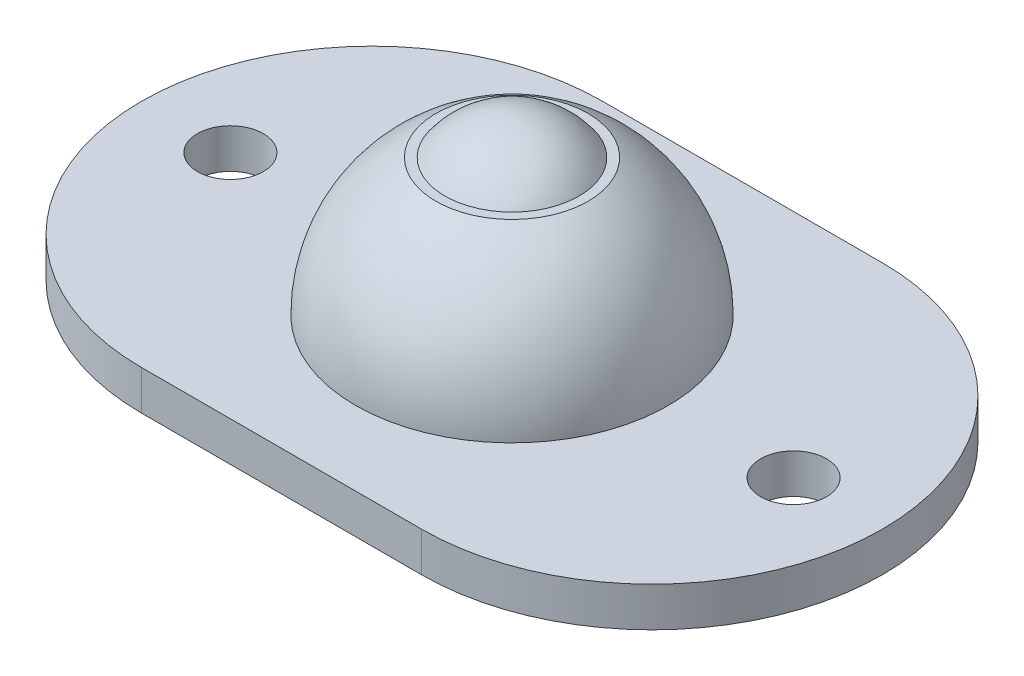
ISO-10303-21;
HEADER;
FILE_DESCRIPTION(('STEP AP214'),'2;1');
FILE_NAME('part.step','',(''),(''),'','','');
FILE_SCHEMA(('AUTOMOTIVE_DESIGN { 1 0 10303 214 1 1 1 1 }'));
ENDSEC;
DATA;
#1=APPLICATION_CONTEXT('core data for automotive mechanical design processes');
#2=APPLICATION_PROTOCOL_DEFINITION('international standard','automotive_design',2000,#1);
#3=PRODUCT_CONTEXT('',#1,'mechanical');
#4=PRODUCT('Part','Part','',(#3));
#5=PRODUCT_RELATED_PRODUCT_CATEGORY('part','',(#4));
#6=PRODUCT_DEFINITION_FORMATION('','',#4);
#7=PRODUCT_DEFINITION_CONTEXT('part definition',#1,'design');
#8=PRODUCT_DEFINITION('design','',#6,#7);
#9=PRODUCT_DEFINITION_SHAPE('','',#8);
#10=(LENGTH_UNIT() NAMED_UNIT(*) SI_UNIT(.MILLI.,.METRE.));
#11=(NAMED_UNIT(*) PLANE_ANGLE_UNIT() SI_UNIT($,.RADIAN.));
#12=(NAMED_UNIT(*) SI_UNIT($,.STERADIAN.) SOLID_ANGLE_UNIT());
#13=UNCERTAINTY_MEASURE_WITH_UNIT(LENGTH_MEASURE(1.E-05),#10,'distance_accuracy_value','');
#14=(GEOMETRIC_REPRESENTATION_CONTEXT(3) GLOBAL_UNCERTAINTY_ASSIGNED_CONTEXT((#13)) GLOBAL_UNIT_ASSIGNED_CONTEXT((#10,
#11,#12)) REPRESENTATION_CONTEXT('',''));
#15=CARTESIAN_POINT('',(0.,0.,0.));
#16=DIRECTION('',(0.,0.,1.));
#17=DIRECTION('',(1.,0.,0.));
#18=AXIS2_PLACEMENT_3D('',#15,#16,#17);
#19=CARTESIAN_POINT('',(-8.5,2.4,0.));
#20=DIRECTION('',(0.,1.,0.));
#21=DIRECTION('',(0.,0.,1.));
#22=AXIS2_PLACEMENT_3D('',#19,#20,#21);
#23=PLANE('',#22);
#24=CARTESIAN_POINT('',(0.,2.4,0.));
#25=DIRECTION('',(0.,-1.,0.));
#26=DIRECTION('',(0.,0.,-1.));
#27=AXIS2_PLACEMENT_3D('',#24,#25,#26);
#28=CIRCLE('',#27,9.5);
#29=CARTESIAN_POINT('',(0.,2.4,-9.5));
#30=VERTEX_POINT('',#29);
#31=EDGE_CURVE('E132',#30,#30,#28,.T.);
#32=ORIENTED_EDGE('',*,*,#31,.T.);
#33=EDGE_LOOP('',(#32));
#34=FACE_BOUND('',#33,.T.);
#35=CARTESIAN_POINT('',(17.1,2.4,0.));
#36=DIRECTION('',(0.,1.,0.));
#37=DIRECTION('',(0.,0.,1.));
#38=AXIS2_PLACEMENT_3D('',#35,#36,#37);
#39=CIRCLE('',#38,2.);
#40=CARTESIAN_POINT('',(17.1,2.4,2.));
#41=VERTEX_POINT('',#40);
#42=EDGE_CURVE('E106',#41,#41,#39,.T.);
#43=ORIENTED_EDGE('',*,*,#42,.F.);
#44=EDGE_LOOP('',(#43));
#45=FACE_BOUND('',#44,.T.);
#46=CARTESIAN_POINT('',(-8.5,2.4,0.));
#47=DIRECTION('',(0.,1.,0.));
#48=DIRECTION('',(0.,0.,1.));
#49=AXIS2_PLACEMENT_3D('',#46,#47,#48);
#50=CIRCLE('',#49,14.);
#51=CARTESIAN_POINT('',(-8.5,2.4,-14.));
#52=VERTEX_POINT('',#51);
#53=CARTESIAN_POINT('',(-8.5,2.4,14.));
#54=VERTEX_POINT('',#53);
#55=EDGE_CURVE('E90',#52,#54,#50,.T.);
#56=ORIENTED_EDGE('',*,*,#55,.T.);
#57=DIRECTION('',(1.,0.,0.));
#58=VECTOR('',#57,1.);
#59=CARTESIAN_POINT('',(-8.5,2.4,14.));
#60=LINE('',#59,#58);
#61=CARTESIAN_POINT('',(8.5,2.4,14.));
#62=VERTEX_POINT('',#61);
#63=EDGE_CURVE('E85',#54,#62,#60,.T.);
#64=ORIENTED_EDGE('',*,*,#63,.T.);
#65=CARTESIAN_POINT('',(8.5,2.4,0.));
#66=DIRECTION('',(0.,1.,0.));
#67=DIRECTION('',(0.,0.,1.));
#68=AXIS2_PLACEMENT_3D('',#65,#66,#67);
#69=CIRCLE('',#68,14.);
#70=CARTESIAN_POINT('',(8.5,2.4,-14.));
#71=VERTEX_POINT('',#70);
#72=EDGE_CURVE('E88',#62,#71,#69,.T.);
#73=ORIENTED_EDGE('',*,*,#72,.T.);
#74=DIRECTION('',(-1.,0.,0.));
#75=VECTOR('',#74,1.);
#76=CARTESIAN_POINT('',(-8.5,2.4,-14.));
#77=LINE('',#76,#75);
#78=EDGE_CURVE('E55',#71,#52,#77,.T.);
#79=ORIENTED_EDGE('',*,*,#78,.T.);
#80=EDGE_LOOP('',(#56,#64,#73,#79));
#81=FACE_BOUND('',#80,.T.);
#82=CARTESIAN_POINT('',(-17.1,2.4,0.));
#83=DIRECTION('',(0.,1.,0.));
#84=DIRECTION('',(0.,0.,1.));
#85=AXIS2_PLACEMENT_3D('',#82,#83,#84);
#86=CIRCLE('',#85,2.);
#87=CARTESIAN_POINT('',(-17.1,2.4,2.));
#88=VERTEX_POINT('',#87);
#89=EDGE_CURVE('E121',#88,#88,#86,.T.);
#90=ORIENTED_EDGE('',*,*,#89,.F.);
#91=EDGE_LOOP('',(#90));
#92=FACE_BOUND('',#91,.T.);
#93=ADVANCED_FACE('F37',(#34,#45,#81,#92),#23,.T.);
#94=CARTESIAN_POINT('',(-8.5,0.,0.));
#95=DIRECTION('',(0.,1.,0.));
#96=DIRECTION('',(0.,0.,1.));
#97=AXIS2_PLACEMENT_3D('',#94,#95,#96);
#98=PLANE('',#97);
#99=CARTESIAN_POINT('',(-8.5,0.,0.));
#100=DIRECTION('',(0.,1.,0.));
#101=DIRECTION('',(0.,0.,1.));
#102=AXIS2_PLACEMENT_3D('',#99,#100,#101);
#103=CIRCLE('',#102,14.);
#104=CARTESIAN_POINT('',(-8.5,0.,-14.));
#105=VERTEX_POINT('',#104);
#106=CARTESIAN_POINT('',(-8.5,0.,14.));
#107=VERTEX_POINT('',#106);
#108=EDGE_CURVE('E103',#105,#107,#103,.T.);
#109=ORIENTED_EDGE('',*,*,#108,.F.);
#110=DIRECTION('',(-1.,0.,0.));
#111=VECTOR('',#110,1.);
#112=CARTESIAN_POINT('',(-8.5,0.,-14.));
#113=LINE('',#112,#111);
#114=CARTESIAN_POINT('',(8.5,0.,-14.));
#115=VERTEX_POINT('',#114);
#116=EDGE_CURVE('E78',#115,#105,#113,.T.);
#117=ORIENTED_EDGE('',*,*,#116,.F.);
#118=CARTESIAN_POINT('',(8.5,0.,0.));
#119=DIRECTION('',(0.,1.,0.));
#120=DIRECTION('',(0.,0.,1.));
#121=AXIS2_PLACEMENT_3D('',#118,#119,#120);
#122=CIRCLE('',#121,14.);
#123=CARTESIAN_POINT('',(8.5,0.,14.));
#124=VERTEX_POINT('',#123);
#125=EDGE_CURVE('E72',#124,#115,#122,.T.);
#126=ORIENTED_EDGE('',*,*,#125,.F.);
#127=DIRECTION('',(1.,0.,0.));
#128=VECTOR('',#127,1.);
#129=CARTESIAN_POINT('',(-8.5,0.,14.));
#130=LINE('',#129,#128);
#131=EDGE_CURVE('E94',#107,#124,#130,.T.);
#132=ORIENTED_EDGE('',*,*,#131,.F.);
#133=EDGE_LOOP('',(#109,#117,#126,#132));
#134=FACE_BOUND('',#133,.T.);
#135=CARTESIAN_POINT('',(17.1,0.,0.));
#136=DIRECTION('',(0.,1.,0.));
#137=DIRECTION('',(0.,0.,1.));
#138=AXIS2_PLACEMENT_3D('',#135,#136,#137);
#139=CIRCLE('',#138,2.);
#140=CARTESIAN_POINT('',(17.1,0.,2.));
#141=VERTEX_POINT('',#140);
#142=EDGE_CURVE('E118',#141,#141,#139,.T.);
#143=ORIENTED_EDGE('',*,*,#142,.T.);
#144=EDGE_LOOP('',(#143));
#145=FACE_BOUND('',#144,.T.);
#146=CARTESIAN_POINT('',(-17.1,0.,0.));
#147=DIRECTION('',(0.,1.,0.));
#148=DIRECTION('',(0.,0.,1.));
#149=AXIS2_PLACEMENT_3D('',#146,#147,#148);
#150=CIRCLE('',#149,2.);
#151=CARTESIAN_POINT('',(-17.1,0.,2.));
#152=VERTEX_POINT('',#151);
#153=EDGE_CURVE('E124',#152,#152,#150,.T.);
#154=ORIENTED_EDGE('',*,*,#153,.T.);
#155=EDGE_LOOP('',(#154));
#156=FACE_BOUND('',#155,.T.);
#157=ADVANCED_FACE('F114',(#134,#145,#156),#98,.F.);
#158=CARTESIAN_POINT('',(-8.5,2.4,0.));
#159=DIRECTION('',(0.,-1.,0.));
#160=DIRECTION('',(0.,0.,-1.));
#161=AXIS2_PLACEMENT_3D('',#158,#159,#160);
#162=CYLINDRICAL_SURFACE('',#161,14.);
#163=ORIENTED_EDGE('',*,*,#108,.T.);
#164=DIRECTION('',(0.,-1.,0.));
#165=VECTOR('',#164,1.);
#166=CARTESIAN_POINT('',(-8.5,2.4,14.));
#167=LINE('',#166,#165);
#168=EDGE_CURVE('E11',#54,#107,#167,.T.);
#169=ORIENTED_EDGE('',*,*,#168,.F.);
#170=ORIENTED_EDGE('',*,*,#55,.F.);
#171=DIRECTION('',(0.,-1.,0.));
#172=VECTOR('',#171,1.);
#173=CARTESIAN_POINT('',(-8.5,2.4,-14.));
#174=LINE('',#173,#172);
#175=EDGE_CURVE('E99',#52,#105,#174,.T.);
#176=ORIENTED_EDGE('',*,*,#175,.T.);
#177=EDGE_LOOP('',(#163,#169,#170,#176));
#178=FACE_BOUND('',#177,.T.);
#179=ADVANCED_FACE('F39',(#178),#162,.T.);
#180=CARTESIAN_POINT('',(-8.5,2.4,14.));
#181=DIRECTION('',(0.,0.,-1.));
#182=DIRECTION('',(-1.,0.,0.));
#183=AXIS2_PLACEMENT_3D('',#180,#181,#182);
#184=PLANE('',#183);
#185=ORIENTED_EDGE('',*,*,#131,.T.);
#186=DIRECTION('',(0.,-1.,0.));
#187=VECTOR('',#186,1.);
#188=CARTESIAN_POINT('',(8.5,2.4,14.));
#189=LINE('',#188,#187);
#190=EDGE_CURVE('E47',#62,#124,#189,.T.);
#191=ORIENTED_EDGE('',*,*,#190,.F.);
#192=ORIENTED_EDGE('',*,*,#63,.F.);
#193=ORIENTED_EDGE('',*,*,#168,.T.);
#194=EDGE_LOOP('',(#185,#191,#192,#193));
#195=FACE_BOUND('',#194,.T.);
#196=ADVANCED_FACE('F93',(#195),#184,.F.);
#197=CARTESIAN_POINT('',(8.5,2.4,0.));
#198=DIRECTION('',(0.,-1.,0.));
#199=DIRECTION('',(0.,0.,-1.));
#200=AXIS2_PLACEMENT_3D('',#197,#198,#199);
#201=CYLINDRICAL_SURFACE('',#200,14.);
#202=ORIENTED_EDGE('',*,*,#125,.T.);
#203=DIRECTION('',(0.,-1.,0.));
#204=VECTOR('',#203,1.);
#205=CARTESIAN_POINT('',(8.5,2.4,-14.));
#206=LINE('',#205,#204);
#207=EDGE_CURVE('E95',#71,#115,#206,.T.);
#208=ORIENTED_EDGE('',*,*,#207,.F.);
#209=ORIENTED_EDGE('',*,*,#72,.F.);
#210=ORIENTED_EDGE('',*,*,#190,.T.);
#211=EDGE_LOOP('',(#202,#208,#209,#210));
#212=FACE_BOUND('',#211,.T.);
#213=ADVANCED_FACE('F97',(#212),#201,.T.);
#214=CARTESIAN_POINT('',(-8.5,2.4,-14.));
#215=DIRECTION('',(0.,0.,1.));
#216=DIRECTION('',(1.,0.,0.));
#217=AXIS2_PLACEMENT_3D('',#214,#215,#216);
#218=PLANE('',#217);
#219=ORIENTED_EDGE('',*,*,#116,.T.);
#220=ORIENTED_EDGE('',*,*,#175,.F.);
#221=ORIENTED_EDGE('',*,*,#78,.F.);
#222=ORIENTED_EDGE('',*,*,#207,.T.);
#223=EDGE_LOOP('',(#219,#220,#221,#222));
#224=FACE_BOUND('',#223,.T.);
#225=ADVANCED_FACE('F111',(#224),#218,.F.);
#226=CARTESIAN_POINT('',(17.1,2.4,0.));
#227=DIRECTION('',(0.,-1.,0.));
#228=DIRECTION('',(0.,0.,-1.));
#229=AXIS2_PLACEMENT_3D('',#226,#227,#228);
#230=CYLINDRICAL_SURFACE('',#229,2.);
#231=ORIENTED_EDGE('',*,*,#42,.T.);
#232=EDGE_LOOP('',(#231));
#233=FACE_BOUND('',#232,.T.);
#234=ORIENTED_EDGE('',*,*,#142,.F.);
#235=EDGE_LOOP('',(#234));
#236=FACE_BOUND('',#235,.T.);
#237=ADVANCED_FACE('F159',(#233,#236),#230,.F.);
#238=CARTESIAN_POINT('',(-17.1,2.4,0.));
#239=DIRECTION('',(0.,-1.,0.));
#240=DIRECTION('',(0.,0.,-1.));
#241=AXIS2_PLACEMENT_3D('',#238,#239,#240);
#242=CYLINDRICAL_SURFACE('',#241,2.);
#243=ORIENTED_EDGE('',*,*,#89,.T.);
#244=EDGE_LOOP('',(#243));
#245=FACE_BOUND('',#244,.T.);
#246=ORIENTED_EDGE('',*,*,#153,.F.);
#247=EDGE_LOOP('',(#246));
#248=FACE_BOUND('',#247,.T.);
#249=ADVANCED_FACE('F216',(#245,#248),#242,.F.);
#250=CARTESIAN_POINT('',(0.,10.7,4.62168800331654));
#251=DIRECTION('',(0.,-1.,0.));
#252=DIRECTION('',(0.,0.,-1.));
#253=AXIS2_PLACEMENT_3D('',#250,#251,#252);
#254=PLANE('',#253);
#255=CARTESIAN_POINT('',(0.,10.7,0.));
#256=DIRECTION('',(0.,-1.,0.));
#257=DIRECTION('',(0.,0.,-1.));
#258=AXIS2_PLACEMENT_3D('',#255,#256,#257);
#259=CIRCLE('',#258,4.07308237088326);
#260=CARTESIAN_POINT('',(0.,10.7,-4.07308237088326));
#261=VERTEX_POINT('',#260);
#262=EDGE_CURVE('E41',#261,#261,#259,.T.);
#263=ORIENTED_EDGE('',*,*,#262,.T.);
#264=EDGE_LOOP('',(#263));
#265=FACE_BOUND('',#264,.T.);
#266=CARTESIAN_POINT('',(0.,10.7,0.));
#267=DIRECTION('',(0.,-1.,0.));
#268=DIRECTION('',(0.,0.,-1.));
#269=AXIS2_PLACEMENT_3D('',#266,#267,#268);
#270=CIRCLE('',#269,4.62168800331654);
#271=CARTESIAN_POINT('',(0.,10.7,-4.62168800331654));
#272=VERTEX_POINT('',#271);
#273=EDGE_CURVE('E127',#272,#272,#270,.T.);
#274=ORIENTED_EDGE('',*,*,#273,.F.);
#275=EDGE_LOOP('',(#274));
#276=FACE_BOUND('',#275,.T.);
#277=ADVANCED_FACE('F139',(#265,#276),#254,.F.);
#278=CARTESIAN_POINT('',(0.,2.4,0.));
#279=DIRECTION('',(0.,-1.,0.));
#280=DIRECTION('',(0.,0.,1.));
#281=AXIS2_PLACEMENT_3D('',#278,#279,#280);
#282=SPHERICAL_SURFACE('',#281,9.5);
#283=ORIENTED_EDGE('',*,*,#31,.F.);
#284=EDGE_LOOP('',(#283));
#285=FACE_BOUND('',#284,.T.);
#286=ORIENTED_EDGE('',*,*,#273,.T.);
#287=EDGE_LOOP('',(#286));
#288=FACE_BOUND('',#287,.T.);
#289=ADVANCED_FACE('F144',(#285,#288),#282,.T.);
#290=CARTESIAN_POINT('',(0.,7.8,0.));
#291=DIRECTION('',(0.,1.,0.));
#292=DIRECTION('',(0.,0.,-1.));
#293=AXIS2_PLACEMENT_3D('',#290,#291,#292);
#294=SPHERICAL_SURFACE('',#293,5.);
#295=ORIENTED_EDGE('',*,*,#262,.F.);
#296=EDGE_LOOP('',(#295));
#297=FACE_BOUND('',#296,.T.);
#298=ADVANCED_FACE('F142',(#297),#294,.T.);
#299=CLOSED_SHELL('',(#93,#157,#179,#196,#213,#225,#237,#249,#277,#289,#298));
#300=MANIFOLD_SOLID_BREP('B2',#299);
#301=ADVANCED_BREP_SHAPE_REPRESENTATION('',(#18,#300),#14);
#302=SHAPE_DEFINITION_REPRESENTATION(#9,#301);
ENDSEC;
END-ISO-10303-21;
